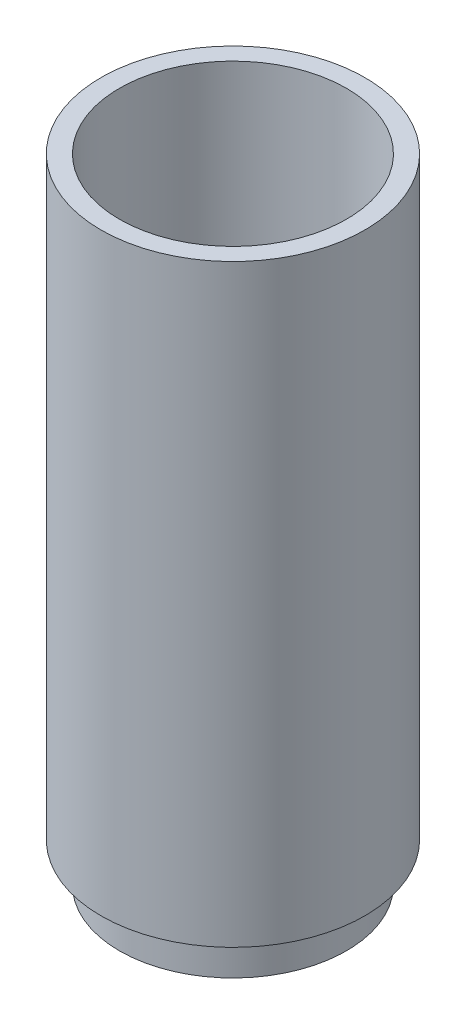
ISO-10303-21;
HEADER;
FILE_DESCRIPTION(('STEP AP214'),'2;1');
FILE_NAME('part.step','',(''),(''),'','','');
FILE_SCHEMA(('AUTOMOTIVE_DESIGN { 1 0 10303 214 1 1 1 1 }'));
ENDSEC;
DATA;
#1=APPLICATION_CONTEXT('core data for automotive mechanical design processes');
#2=APPLICATION_PROTOCOL_DEFINITION('international standard','automotive_design',2000,#1);
#3=PRODUCT_CONTEXT('',#1,'mechanical');
#4=PRODUCT('Part','Part','',(#3));
#5=PRODUCT_RELATED_PRODUCT_CATEGORY('part','',(#4));
#6=PRODUCT_DEFINITION_FORMATION('','',#4);
#7=PRODUCT_DEFINITION_CONTEXT('part definition',#1,'design');
#8=PRODUCT_DEFINITION('design','',#6,#7);
#9=PRODUCT_DEFINITION_SHAPE('','',#8);
#10=(LENGTH_UNIT() NAMED_UNIT(*) SI_UNIT(.MILLI.,.METRE.));
#11=(NAMED_UNIT(*) PLANE_ANGLE_UNIT() SI_UNIT($,.RADIAN.));
#12=(NAMED_UNIT(*) SI_UNIT($,.STERADIAN.) SOLID_ANGLE_UNIT());
#13=UNCERTAINTY_MEASURE_WITH_UNIT(LENGTH_MEASURE(1.E-05),#10,'distance_accuracy_value','');
#14=(GEOMETRIC_REPRESENTATION_CONTEXT(3) GLOBAL_UNCERTAINTY_ASSIGNED_CONTEXT((#13)) GLOBAL_UNIT_ASSIGNED_CONTEXT((#10,
#11,#12)) REPRESENTATION_CONTEXT('',''));
#15=CARTESIAN_POINT('',(0.,0.,0.));
#16=DIRECTION('',(0.,0.,1.));
#17=DIRECTION('',(1.,0.,0.));
#18=AXIS2_PLACEMENT_3D('',#15,#16,#17);
#19=CARTESIAN_POINT('',(0.,225.,0.));
#20=DIRECTION('',(0.,-1.,0.));
#21=DIRECTION('',(0.,0.,-1.));
#22=AXIS2_PLACEMENT_3D('',#19,#20,#21);
#23=CYLINDRICAL_SURFACE('',#22,50.);
#24=CARTESIAN_POINT('',(0.,225.,0.));
#25=DIRECTION('',(0.,1.,0.));
#26=DIRECTION('',(0.,0.,1.));
#27=AXIS2_PLACEMENT_3D('',#24,#25,#26);
#28=CIRCLE('',#27,50.);
#29=CARTESIAN_POINT('',(0.,225.,50.));
#30=VERTEX_POINT('',#29);
#31=EDGE_CURVE('E42',#30,#30,#28,.T.);
#32=ORIENTED_EDGE('',*,*,#31,.F.);
#33=EDGE_LOOP('',(#32));
#34=FACE_BOUND('',#33,.T.);
#35=CARTESIAN_POINT('',(0.,0.,0.));
#36=DIRECTION('',(0.,1.,0.));
#37=DIRECTION('',(0.,0.,1.));
#38=AXIS2_PLACEMENT_3D('',#35,#36,#37);
#39=CIRCLE('',#38,50.);
#40=CARTESIAN_POINT('',(0.,0.,50.));
#41=VERTEX_POINT('',#40);
#42=EDGE_CURVE('E38',#41,#41,#39,.T.);
#43=ORIENTED_EDGE('',*,*,#42,.T.);
#44=EDGE_LOOP('',(#43));
#45=FACE_BOUND('',#44,.T.);
#46=ADVANCED_FACE('F35',(#34,#45),#23,.T.);
#47=CARTESIAN_POINT('',(0.,225.,0.));
#48=DIRECTION('',(0.,1.,0.));
#49=DIRECTION('',(0.,0.,1.));
#50=AXIS2_PLACEMENT_3D('',#47,#48,#49);
#51=PLANE('',#50);
#52=CARTESIAN_POINT('',(0.,225.,0.));
#53=DIRECTION('',(0.,1.,0.));
#54=DIRECTION('',(0.,0.,1.));
#55=AXIS2_PLACEMENT_3D('',#52,#53,#54);
#56=CIRCLE('',#55,43.);
#57=CARTESIAN_POINT('',(0.,225.,43.));
#58=VERTEX_POINT('',#57);
#59=EDGE_CURVE('E53',#58,#58,#56,.T.);
#60=ORIENTED_EDGE('',*,*,#59,.F.);
#61=EDGE_LOOP('',(#60));
#62=FACE_BOUND('',#61,.T.);
#63=ORIENTED_EDGE('',*,*,#31,.T.);
#64=EDGE_LOOP('',(#63));
#65=FACE_BOUND('',#64,.T.);
#66=ADVANCED_FACE('F64',(#62,#65),#51,.T.);
#67=CARTESIAN_POINT('',(0.,0.,0.));
#68=DIRECTION('',(0.,1.,0.));
#69=DIRECTION('',(0.,0.,1.));
#70=AXIS2_PLACEMENT_3D('',#67,#68,#69);
#71=PLANE('',#70);
#72=CARTESIAN_POINT('',(0.,0.,0.));
#73=DIRECTION('',(0.,-1.,0.));
#74=DIRECTION('',(0.,0.,-1.));
#75=AXIS2_PLACEMENT_3D('',#72,#73,#74);
#76=CIRCLE('',#75,43.);
#77=CARTESIAN_POINT('',(0.,0.,-43.));
#78=VERTEX_POINT('',#77);
#79=EDGE_CURVE('E10',#78,#78,#76,.T.);
#80=ORIENTED_EDGE('',*,*,#79,.F.);
#81=EDGE_LOOP('',(#80));
#82=FACE_BOUND('',#81,.T.);
#83=ORIENTED_EDGE('',*,*,#42,.F.);
#84=EDGE_LOOP('',(#83));
#85=FACE_BOUND('',#84,.T.);
#86=ADVANCED_FACE('F61',(#82,#85),#71,.F.);
#87=CARTESIAN_POINT('',(0.,225.,0.));
#88=DIRECTION('',(0.,-1.,0.));
#89=DIRECTION('',(0.,0.,-1.));
#90=AXIS2_PLACEMENT_3D('',#87,#88,#89);
#91=CYLINDRICAL_SURFACE('',#90,43.);
#92=ORIENTED_EDGE('',*,*,#59,.T.);
#93=EDGE_LOOP('',(#92));
#94=FACE_BOUND('',#93,.T.);
#95=CARTESIAN_POINT('',(0.,7.00000000000001,0.));
#96=DIRECTION('',(0.,1.,0.));
#97=DIRECTION('',(0.,0.,1.));
#98=AXIS2_PLACEMENT_3D('',#95,#96,#97);
#99=CIRCLE('',#98,43.);
#100=CARTESIAN_POINT('',(0.,7.00000000000001,43.));
#101=VERTEX_POINT('',#100);
#102=EDGE_CURVE('E50',#101,#101,#99,.T.);
#103=ORIENTED_EDGE('',*,*,#102,.F.);
#104=EDGE_LOOP('',(#103));
#105=FACE_BOUND('',#104,.T.);
#106=ADVANCED_FACE('F63',(#94,#105),#91,.F.);
#107=CARTESIAN_POINT('',(0.,7.,0.));
#108=DIRECTION('',(0.,1.,0.));
#109=DIRECTION('',(0.,0.,1.));
#110=AXIS2_PLACEMENT_3D('',#107,#108,#109);
#111=PLANE('',#110);
#112=ORIENTED_EDGE('',*,*,#102,.T.);
#113=EDGE_LOOP('',(#112));
#114=FACE_BOUND('',#113,.T.);
#115=ADVANCED_FACE('F70',(#114),#111,.T.);
#116=CARTESIAN_POINT('',(0.,-15.,0.));
#117=DIRECTION('',(0.,1.,0.));
#118=DIRECTION('',(0.,0.,1.));
#119=AXIS2_PLACEMENT_3D('',#116,#117,#118);
#120=CYLINDRICAL_SURFACE('',#119,43.);
#121=CARTESIAN_POINT('',(0.,-15.,0.));
#122=DIRECTION('',(0.,-1.,0.));
#123=DIRECTION('',(0.,0.,-1.));
#124=AXIS2_PLACEMENT_3D('',#121,#122,#123);
#125=CIRCLE('',#124,43.);
#126=CARTESIAN_POINT('',(0.,-15.,-43.));
#127=VERTEX_POINT('',#126);
#128=EDGE_CURVE('E49',#127,#127,#125,.T.);
#129=ORIENTED_EDGE('',*,*,#128,.F.);
#130=EDGE_LOOP('',(#129));
#131=FACE_BOUND('',#130,.T.);
#132=ORIENTED_EDGE('',*,*,#79,.T.);
#133=EDGE_LOOP('',(#132));
#134=FACE_BOUND('',#133,.T.);
#135=ADVANCED_FACE('F101',(#131,#134),#120,.T.);
#136=CARTESIAN_POINT('',(0.,-15.,0.));
#137=DIRECTION('',(0.,-1.,0.));
#138=DIRECTION('',(0.,0.,-1.));
#139=AXIS2_PLACEMENT_3D('',#136,#137,#138);
#140=PLANE('',#139);
#141=ORIENTED_EDGE('',*,*,#128,.T.);
#142=EDGE_LOOP('',(#141));
#143=FACE_BOUND('',#142,.T.);
#144=ADVANCED_FACE('F117',(#143),#140,.T.);
#145=CLOSED_SHELL('',(#46,#66,#86,#106,#115,#135,#144));
#146=MANIFOLD_SOLID_BREP('B2',#145);
#147=ADVANCED_BREP_SHAPE_REPRESENTATION('',(#18,#146),#14);
#148=SHAPE_DEFINITION_REPRESENTATION(#9,#147);
ENDSEC;
END-ISO-10303-21;
